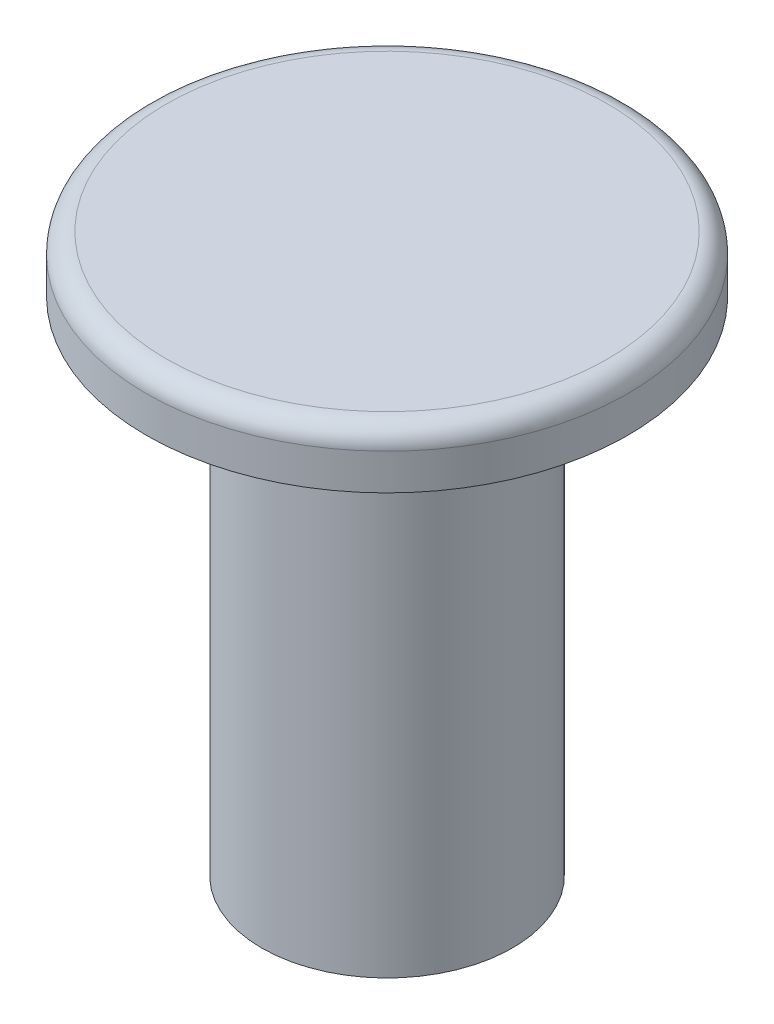
ISO-10303-21;
HEADER;
FILE_DESCRIPTION(('STEP AP214'),'2;1');
FILE_NAME('part.step','',(''),(''),'','','');
FILE_SCHEMA(('AUTOMOTIVE_DESIGN { 1 0 10303 214 1 1 1 1 }'));
ENDSEC;
DATA;
#1=APPLICATION_CONTEXT('core data for automotive mechanical design processes');
#2=APPLICATION_PROTOCOL_DEFINITION('international standard','automotive_design',2000,#1);
#3=PRODUCT_CONTEXT('',#1,'mechanical');
#4=PRODUCT('Part','Part','',(#3));
#5=PRODUCT_RELATED_PRODUCT_CATEGORY('part','',(#4));
#6=PRODUCT_DEFINITION_FORMATION('','',#4);
#7=PRODUCT_DEFINITION_CONTEXT('part definition',#1,'design');
#8=PRODUCT_DEFINITION('design','',#6,#7);
#9=PRODUCT_DEFINITION_SHAPE('','',#8);
#10=(LENGTH_UNIT() NAMED_UNIT(*) SI_UNIT(.MILLI.,.METRE.));
#11=(NAMED_UNIT(*) PLANE_ANGLE_UNIT() SI_UNIT($,.RADIAN.));
#12=(NAMED_UNIT(*) SI_UNIT($,.STERADIAN.) SOLID_ANGLE_UNIT());
#13=UNCERTAINTY_MEASURE_WITH_UNIT(LENGTH_MEASURE(1.E-05),#10,'distance_accuracy_value','');
#14=(GEOMETRIC_REPRESENTATION_CONTEXT(3) GLOBAL_UNCERTAINTY_ASSIGNED_CONTEXT((#13)) GLOBAL_UNIT_ASSIGNED_CONTEXT((#10,
#11,#12)) REPRESENTATION_CONTEXT('',''));
#15=CARTESIAN_POINT('',(0.,0.,0.));
#16=DIRECTION('',(0.,0.,1.));
#17=DIRECTION('',(1.,0.,0.));
#18=AXIS2_PLACEMENT_3D('',#15,#16,#17);
#19=CARTESIAN_POINT('',(0.,10.,0.));
#20=DIRECTION('',(0.,-1.,0.));
#21=DIRECTION('',(0.,0.,-1.));
#22=AXIS2_PLACEMENT_3D('',#19,#20,#21);
#23=CYLINDRICAL_SURFACE('',#22,2.5);
#24=CARTESIAN_POINT('',(0.,10.,0.));
#25=DIRECTION('',(0.,1.,0.));
#26=DIRECTION('',(0.,0.,1.));
#27=AXIS2_PLACEMENT_3D('',#24,#25,#26);
#28=CIRCLE('',#27,2.5);
#29=CARTESIAN_POINT('',(0.,10.,2.5));
#30=VERTEX_POINT('',#29);
#31=EDGE_CURVE('E56',#30,#30,#28,.T.);
#32=ORIENTED_EDGE('',*,*,#31,.F.);
#33=EDGE_LOOP('',(#32));
#34=FACE_BOUND('',#33,.T.);
#35=CARTESIAN_POINT('',(0.,0.,0.));
#36=DIRECTION('',(0.,1.,0.));
#37=DIRECTION('',(0.,0.,1.));
#38=AXIS2_PLACEMENT_3D('',#35,#36,#37);
#39=CIRCLE('',#38,2.5);
#40=CARTESIAN_POINT('',(0.,0.,2.5));
#41=VERTEX_POINT('',#40);
#42=EDGE_CURVE('E61',#41,#41,#39,.T.);
#43=ORIENTED_EDGE('',*,*,#42,.T.);
#44=EDGE_LOOP('',(#43));
#45=FACE_BOUND('',#44,.T.);
#46=ADVANCED_FACE('F43',(#34,#45),#23,.T.);
#47=CARTESIAN_POINT('',(0.,0.,0.));
#48=DIRECTION('',(0.,1.,0.));
#49=DIRECTION('',(0.,0.,1.));
#50=AXIS2_PLACEMENT_3D('',#47,#48,#49);
#51=PLANE('',#50);
#52=ORIENTED_EDGE('',*,*,#42,.F.);
#53=EDGE_LOOP('',(#52));
#54=FACE_BOUND('',#53,.T.);
#55=ADVANCED_FACE('F89',(#54),#51,.F.);
#56=CARTESIAN_POINT('',(0.,11.12,0.));
#57=DIRECTION('',(0.,-1.,0.));
#58=DIRECTION('',(0.,0.,-1.));
#59=AXIS2_PLACEMENT_3D('',#56,#57,#58);
#60=CYLINDRICAL_SURFACE('',#59,4.8);
#61=CARTESIAN_POINT('',(0.,10.72,0.));
#62=DIRECTION('',(0.,1.,0.));
#63=DIRECTION('',(0.,0.,1.));
#64=AXIS2_PLACEMENT_3D('',#61,#62,#63);
#65=CIRCLE('',#64,4.8);
#66=CARTESIAN_POINT('',(0.,10.72,4.8));
#67=VERTEX_POINT('',#66);
#68=EDGE_CURVE('E10',#67,#67,#65,.F.);
#69=ORIENTED_EDGE('',*,*,#68,.T.);
#70=EDGE_LOOP('',(#69));
#71=FACE_BOUND('',#70,.T.);
#72=CARTESIAN_POINT('',(0.,10.,0.));
#73=DIRECTION('',(0.,1.,0.));
#74=DIRECTION('',(0.,0.,1.));
#75=AXIS2_PLACEMENT_3D('',#72,#73,#74);
#76=CIRCLE('',#75,4.8);
#77=CARTESIAN_POINT('',(0.,10.,4.8));
#78=VERTEX_POINT('',#77);
#79=EDGE_CURVE('E66',#78,#78,#76,.T.);
#80=ORIENTED_EDGE('',*,*,#79,.T.);
#81=EDGE_LOOP('',(#80));
#82=FACE_BOUND('',#81,.T.);
#83=ADVANCED_FACE('F72',(#71,#82),#60,.T.);
#84=CARTESIAN_POINT('',(0.,11.12,0.));
#85=DIRECTION('',(0.,1.,0.));
#86=DIRECTION('',(0.,0.,1.));
#87=AXIS2_PLACEMENT_3D('',#84,#85,#86);
#88=PLANE('',#87);
#89=CARTESIAN_POINT('',(0.,11.12,0.));
#90=DIRECTION('',(0.,1.,0.));
#91=DIRECTION('',(0.,0.,1.));
#92=AXIS2_PLACEMENT_3D('',#89,#90,#91);
#93=CIRCLE('',#92,4.4);
#94=CARTESIAN_POINT('',(0.,11.12,4.4));
#95=VERTEX_POINT('',#94);
#96=EDGE_CURVE('E51',#95,#95,#93,.T.);
#97=ORIENTED_EDGE('',*,*,#96,.T.);
#98=EDGE_LOOP('',(#97));
#99=FACE_BOUND('',#98,.T.);
#100=ADVANCED_FACE('F76',(#99),#88,.T.);
#101=CARTESIAN_POINT('',(0.,10.,0.));
#102=DIRECTION('',(0.,1.,0.));
#103=DIRECTION('',(0.,0.,1.));
#104=AXIS2_PLACEMENT_3D('',#101,#102,#103);
#105=PLANE('',#104);
#106=ORIENTED_EDGE('',*,*,#31,.T.);
#107=EDGE_LOOP('',(#106));
#108=FACE_BOUND('',#107,.T.);
#109=ORIENTED_EDGE('',*,*,#79,.F.);
#110=EDGE_LOOP('',(#109));
#111=FACE_BOUND('',#110,.T.);
#112=ADVANCED_FACE('F74',(#108,#111),#105,.F.);
#113=CARTESIAN_POINT('',(0.,10.72,0.));
#114=DIRECTION('',(0.,1.,0.));
#115=DIRECTION('',(0.,0.,1.));
#116=AXIS2_PLACEMENT_3D('',#113,#114,#115);
#117=TOROIDAL_SURFACE('',#116,4.4,0.4);
#118=ORIENTED_EDGE('',*,*,#68,.F.);
#119=EDGE_LOOP('',(#118));
#120=FACE_BOUND('',#119,.T.);
#121=ORIENTED_EDGE('',*,*,#96,.F.);
#122=EDGE_LOOP('',(#121));
#123=FACE_BOUND('',#122,.T.);
#124=ADVANCED_FACE('F45',(#120,#123),#117,.T.);
#125=CLOSED_SHELL('',(#46,#55,#83,#100,#112,#124));
#126=MANIFOLD_SOLID_BREP('B2',#125);
#127=ADVANCED_BREP_SHAPE_REPRESENTATION('',(#18,#126),#14);
#128=SHAPE_DEFINITION_REPRESENTATION(#9,#127);
ENDSEC;
END-ISO-10303-21;
